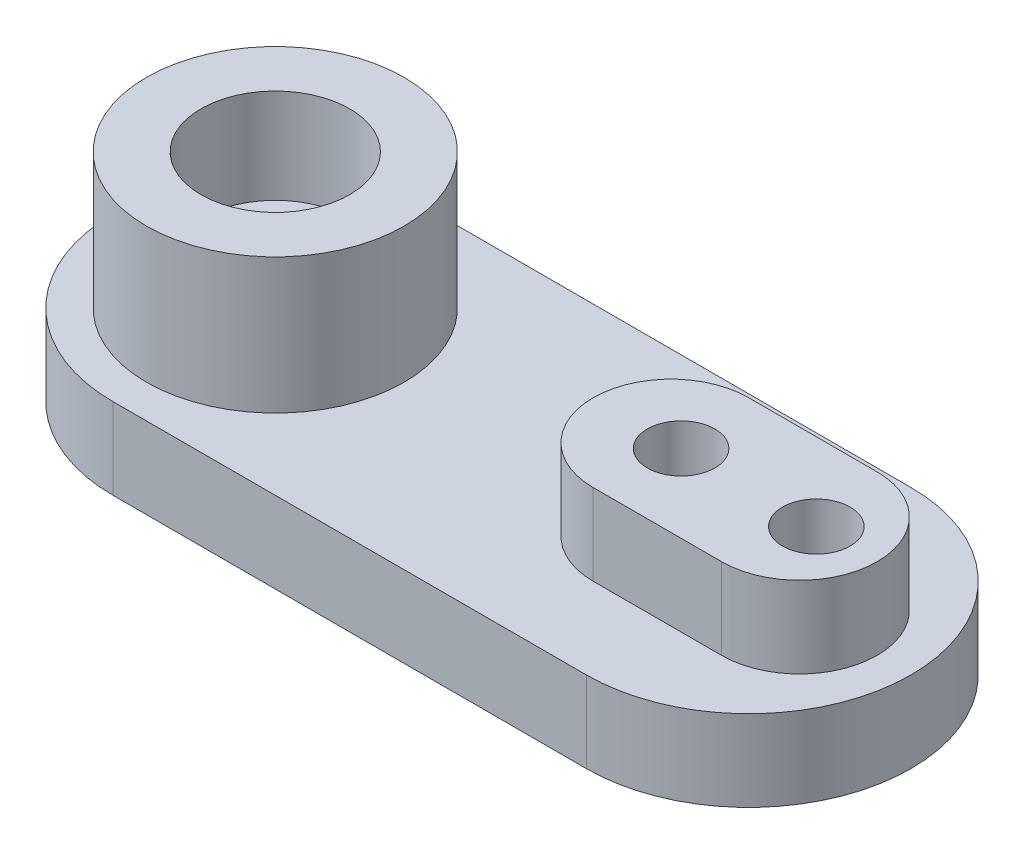
ISO-10303-21;
HEADER;
FILE_DESCRIPTION(('STEP AP214'),'2;1');
FILE_NAME('part.step','',(''),(''),'','','');
FILE_SCHEMA(('AUTOMOTIVE_DESIGN { 1 0 10303 214 1 1 1 1 }'));
ENDSEC;
DATA;
#1=APPLICATION_CONTEXT('core data for automotive mechanical design processes');
#2=APPLICATION_PROTOCOL_DEFINITION('international standard','automotive_design',2000,#1);
#3=PRODUCT_CONTEXT('',#1,'mechanical');
#4=PRODUCT('Part','Part','',(#3));
#5=PRODUCT_RELATED_PRODUCT_CATEGORY('part','',(#4));
#6=PRODUCT_DEFINITION_FORMATION('','',#4);
#7=PRODUCT_DEFINITION_CONTEXT('part definition',#1,'design');
#8=PRODUCT_DEFINITION('design','',#6,#7);
#9=PRODUCT_DEFINITION_SHAPE('','',#8);
#10=(LENGTH_UNIT() NAMED_UNIT(*) SI_UNIT(.MILLI.,.METRE.));
#11=(NAMED_UNIT(*) PLANE_ANGLE_UNIT() SI_UNIT($,.RADIAN.));
#12=(NAMED_UNIT(*) SI_UNIT($,.STERADIAN.) SOLID_ANGLE_UNIT());
#13=UNCERTAINTY_MEASURE_WITH_UNIT(LENGTH_MEASURE(1.E-05),#10,'distance_accuracy_value','');
#14=(GEOMETRIC_REPRESENTATION_CONTEXT(3) GLOBAL_UNCERTAINTY_ASSIGNED_CONTEXT((#13)) GLOBAL_UNIT_ASSIGNED_CONTEXT((#10,
#11,#12)) REPRESENTATION_CONTEXT('',''));
#15=CARTESIAN_POINT('',(0.,0.,0.));
#16=DIRECTION('',(0.,0.,1.));
#17=DIRECTION('',(1.,0.,0.));
#18=AXIS2_PLACEMENT_3D('',#15,#16,#17);
#19=CARTESIAN_POINT('',(0.,0.,0.));
#20=DIRECTION('',(0.,1.,0.));
#21=DIRECTION('',(0.,0.,1.));
#22=AXIS2_PLACEMENT_3D('',#19,#20,#21);
#23=CYLINDRICAL_SURFACE('',#22,1.75);
#24=CARTESIAN_POINT('',(0.,4.5,0.));
#25=DIRECTION('',(0.,1.,0.));
#26=DIRECTION('',(0.,0.,1.));
#27=AXIS2_PLACEMENT_3D('',#24,#25,#26);
#28=CIRCLE('',#27,1.75);
#29=CARTESIAN_POINT('',(0.,4.5,1.75));
#30=VERTEX_POINT('',#29);
#31=EDGE_CURVE('E271',#30,#30,#28,.T.);
#32=ORIENTED_EDGE('',*,*,#31,.T.);
#33=EDGE_LOOP('',(#32));
#34=FACE_BOUND('',#33,.T.);
#35=CARTESIAN_POINT('',(0.,2.5,0.));
#36=DIRECTION('',(0.,-1.,0.));
#37=DIRECTION('',(0.,0.,-1.));
#38=AXIS2_PLACEMENT_3D('',#35,#36,#37);
#39=CIRCLE('',#38,1.75);
#40=CARTESIAN_POINT('',(0.,2.5,-1.75));
#41=VERTEX_POINT('',#40);
#42=EDGE_CURVE('E36',#41,#41,#39,.F.);
#43=ORIENTED_EDGE('',*,*,#42,.F.);
#44=EDGE_LOOP('',(#43));
#45=FACE_BOUND('',#44,.T.);
#46=ADVANCED_FACE('F32',(#34,#45),#23,.F.);
#47=CARTESIAN_POINT('',(0.,3.,0.));
#48=DIRECTION('',(0.,1.,0.));
#49=DIRECTION('',(0.,0.,1.));
#50=AXIS2_PLACEMENT_3D('',#47,#48,#49);
#51=PLANE('',#50);
#52=CARTESIAN_POINT('',(0.,3.,0.));
#53=DIRECTION('',(0.,1.,0.));
#54=DIRECTION('',(0.,0.,1.));
#55=AXIS2_PLACEMENT_3D('',#52,#53,#54);
#56=CIRCLE('',#55,4.7625);
#57=CARTESIAN_POINT('',(0.,3.,4.7625));
#58=VERTEX_POINT('',#57);
#59=EDGE_CURVE('E132',#58,#58,#56,.T.);
#60=ORIENTED_EDGE('',*,*,#59,.F.);
#61=EDGE_LOOP('',(#60));
#62=FACE_BOUND('',#61,.T.);
#63=CARTESIAN_POINT('',(0.,3.,0.));
#64=DIRECTION('',(0.,1.,0.));
#65=DIRECTION('',(0.,0.,1.));
#66=AXIS2_PLACEMENT_3D('',#63,#64,#65);
#67=CIRCLE('',#66,6.);
#68=CARTESIAN_POINT('',(0.,3.,-6.));
#69=VERTEX_POINT('',#68);
#70=CARTESIAN_POINT('',(0.,3.,6.));
#71=VERTEX_POINT('',#70);
#72=EDGE_CURVE('E143',#69,#71,#67,.T.);
#73=ORIENTED_EDGE('',*,*,#72,.T.);
#74=DIRECTION('',(1.,0.,0.));
#75=VECTOR('',#74,1.);
#76=CARTESIAN_POINT('',(0.,3.,6.));
#77=LINE('',#76,#75);
#78=CARTESIAN_POINT('',(17.5,3.,6.));
#79=VERTEX_POINT('',#78);
#80=EDGE_CURVE('E85',#71,#79,#77,.T.);
#81=ORIENTED_EDGE('',*,*,#80,.T.);
#82=CARTESIAN_POINT('',(17.5,3.,0.));
#83=DIRECTION('',(0.,1.,0.));
#84=DIRECTION('',(0.,0.,1.));
#85=AXIS2_PLACEMENT_3D('',#82,#83,#84);
#86=CIRCLE('',#85,6.);
#87=CARTESIAN_POINT('',(17.5,3.,-6.));
#88=VERTEX_POINT('',#87);
#89=EDGE_CURVE('E146',#79,#88,#86,.T.);
#90=ORIENTED_EDGE('',*,*,#89,.T.);
#91=DIRECTION('',(-1.,0.,0.));
#92=VECTOR('',#91,1.);
#93=CARTESIAN_POINT('',(0.,3.,-6.));
#94=LINE('',#93,#92);
#95=EDGE_CURVE('E57',#88,#69,#94,.T.);
#96=ORIENTED_EDGE('',*,*,#95,.T.);
#97=EDGE_LOOP('',(#73,#81,#90,#96));
#98=FACE_BOUND('',#97,.T.);
#99=DIRECTION('',(-1.,0.,0.));
#100=VECTOR('',#99,1.);
#101=CARTESIAN_POINT('',(19.375,3.,-2.875));
#102=LINE('',#101,#100);
#103=CARTESIAN_POINT('',(19.375,3.,-2.875));
#104=VERTEX_POINT('',#103);
#105=CARTESIAN_POINT('',(14.625,3.,-2.875));
#106=VERTEX_POINT('',#105);
#107=EDGE_CURVE('E243',#104,#106,#102,.T.);
#108=ORIENTED_EDGE('',*,*,#107,.F.);
#109=CARTESIAN_POINT('',(19.375,3.,0.));
#110=DIRECTION('',(0.,1.,0.));
#111=DIRECTION('',(0.,0.,1.));
#112=AXIS2_PLACEMENT_3D('',#109,#110,#111);
#113=CIRCLE('',#112,2.875);
#114=CARTESIAN_POINT('',(19.375,3.,2.875));
#115=VERTEX_POINT('',#114);
#116=EDGE_CURVE('E130',#115,#104,#113,.T.);
#117=ORIENTED_EDGE('',*,*,#116,.F.);
#118=DIRECTION('',(1.,0.,0.));
#119=VECTOR('',#118,1.);
#120=CARTESIAN_POINT('',(19.375,3.,2.875));
#121=LINE('',#120,#119);
#122=CARTESIAN_POINT('',(14.625,3.,2.875));
#123=VERTEX_POINT('',#122);
#124=EDGE_CURVE('E126',#123,#115,#121,.T.);
#125=ORIENTED_EDGE('',*,*,#124,.F.);
#126=CARTESIAN_POINT('',(14.625,3.,0.));
#127=DIRECTION('',(0.,1.,0.));
#128=DIRECTION('',(0.,0.,1.));
#129=AXIS2_PLACEMENT_3D('',#126,#127,#128);
#130=CIRCLE('',#129,2.875);
#131=EDGE_CURVE('E245',#106,#123,#130,.T.);
#132=ORIENTED_EDGE('',*,*,#131,.F.);
#133=EDGE_LOOP('',(#108,#117,#125,#132));
#134=FACE_BOUND('',#133,.T.);
#135=ADVANCED_FACE('F185',(#62,#98,#134),#51,.T.);
#136=CARTESIAN_POINT('',(0.,3.,0.));
#137=DIRECTION('',(0.,-1.,0.));
#138=DIRECTION('',(0.,0.,-1.));
#139=AXIS2_PLACEMENT_3D('',#136,#137,#138);
#140=CYLINDRICAL_SURFACE('',#139,6.);
#141=CARTESIAN_POINT('',(0.,0.,0.));
#142=DIRECTION('',(0.,1.,0.));
#143=DIRECTION('',(0.,0.,1.));
#144=AXIS2_PLACEMENT_3D('',#141,#142,#143);
#145=CIRCLE('',#144,6.);
#146=CARTESIAN_POINT('',(0.,0.,-6.));
#147=VERTEX_POINT('',#146);
#148=CARTESIAN_POINT('',(0.,0.,6.));
#149=VERTEX_POINT('',#148);
#150=EDGE_CURVE('E141',#147,#149,#145,.T.);
#151=ORIENTED_EDGE('',*,*,#150,.T.);
#152=DIRECTION('',(0.,-1.,0.));
#153=VECTOR('',#152,1.);
#154=CARTESIAN_POINT('',(0.,3.,6.));
#155=LINE('',#154,#153);
#156=EDGE_CURVE('E11',#71,#149,#155,.T.);
#157=ORIENTED_EDGE('',*,*,#156,.F.);
#158=ORIENTED_EDGE('',*,*,#72,.F.);
#159=DIRECTION('',(0.,-1.,0.));
#160=VECTOR('',#159,1.);
#161=CARTESIAN_POINT('',(0.,3.,-6.));
#162=LINE('',#161,#160);
#163=EDGE_CURVE('E149',#69,#147,#162,.T.);
#164=ORIENTED_EDGE('',*,*,#163,.T.);
#165=EDGE_LOOP('',(#151,#157,#158,#164));
#166=FACE_BOUND('',#165,.T.);
#167=ADVANCED_FACE('F34',(#166),#140,.T.);
#168=CARTESIAN_POINT('',(0.,3.,6.));
#169=DIRECTION('',(0.,0.,-1.));
#170=DIRECTION('',(-1.,0.,0.));
#171=AXIS2_PLACEMENT_3D('',#168,#169,#170);
#172=PLANE('',#171);
#173=DIRECTION('',(1.,0.,0.));
#174=VECTOR('',#173,1.);
#175=CARTESIAN_POINT('',(0.,0.,6.));
#176=LINE('',#175,#174);
#177=CARTESIAN_POINT('',(17.5,0.,6.));
#178=VERTEX_POINT('',#177);
#179=EDGE_CURVE('E152',#149,#178,#176,.T.);
#180=ORIENTED_EDGE('',*,*,#179,.T.);
#181=DIRECTION('',(0.,-1.,0.));
#182=VECTOR('',#181,1.);
#183=CARTESIAN_POINT('',(17.5,3.,6.));
#184=LINE('',#183,#182);
#185=EDGE_CURVE('E41',#79,#178,#184,.T.);
#186=ORIENTED_EDGE('',*,*,#185,.F.);
#187=ORIENTED_EDGE('',*,*,#80,.F.);
#188=ORIENTED_EDGE('',*,*,#156,.T.);
#189=EDGE_LOOP('',(#180,#186,#187,#188));
#190=FACE_BOUND('',#189,.T.);
#191=ADVANCED_FACE('F182',(#190),#172,.F.);
#192=CARTESIAN_POINT('',(17.5,3.,0.));
#193=DIRECTION('',(0.,-1.,0.));
#194=DIRECTION('',(0.,0.,-1.));
#195=AXIS2_PLACEMENT_3D('',#192,#193,#194);
#196=CYLINDRICAL_SURFACE('',#195,6.);
#197=CARTESIAN_POINT('',(17.5,0.,0.));
#198=DIRECTION('',(0.,1.,0.));
#199=DIRECTION('',(0.,0.,1.));
#200=AXIS2_PLACEMENT_3D('',#197,#198,#199);
#201=CIRCLE('',#200,6.);
#202=CARTESIAN_POINT('',(17.5,0.,-6.));
#203=VERTEX_POINT('',#202);
#204=EDGE_CURVE('E154',#178,#203,#201,.T.);
#205=ORIENTED_EDGE('',*,*,#204,.T.);
#206=DIRECTION('',(0.,-1.,0.));
#207=VECTOR('',#206,1.);
#208=CARTESIAN_POINT('',(17.5,3.,-6.));
#209=LINE('',#208,#207);
#210=EDGE_CURVE('E158',#88,#203,#209,.T.);
#211=ORIENTED_EDGE('',*,*,#210,.F.);
#212=ORIENTED_EDGE('',*,*,#89,.F.);
#213=ORIENTED_EDGE('',*,*,#185,.T.);
#214=EDGE_LOOP('',(#205,#211,#212,#213));
#215=FACE_BOUND('',#214,.T.);
#216=ADVANCED_FACE('F164',(#215),#196,.T.);
#217=CARTESIAN_POINT('',(0.,3.,-6.));
#218=DIRECTION('',(0.,0.,1.));
#219=DIRECTION('',(1.,0.,0.));
#220=AXIS2_PLACEMENT_3D('',#217,#218,#219);
#221=PLANE('',#220);
#222=DIRECTION('',(-1.,0.,0.));
#223=VECTOR('',#222,1.);
#224=CARTESIAN_POINT('',(0.,0.,-6.));
#225=LINE('',#224,#223);
#226=EDGE_CURVE('E78',#203,#147,#225,.T.);
#227=ORIENTED_EDGE('',*,*,#226,.T.);
#228=ORIENTED_EDGE('',*,*,#163,.F.);
#229=ORIENTED_EDGE('',*,*,#95,.F.);
#230=ORIENTED_EDGE('',*,*,#210,.T.);
#231=EDGE_LOOP('',(#227,#228,#229,#230));
#232=FACE_BOUND('',#231,.T.);
#233=ADVANCED_FACE('F172',(#232),#221,.F.);
#234=CARTESIAN_POINT('',(0.,0.,0.));
#235=DIRECTION('',(0.,1.,0.));
#236=DIRECTION('',(0.,0.,1.));
#237=AXIS2_PLACEMENT_3D('',#234,#235,#236);
#238=PLANE('',#237);
#239=CARTESIAN_POINT('',(0.,0.,0.));
#240=DIRECTION('',(0.,-1.,0.));
#241=DIRECTION('',(0.,0.,-1.));
#242=AXIS2_PLACEMENT_3D('',#239,#240,#241);
#243=CIRCLE('',#242,3.);
#244=CARTESIAN_POINT('',(0.,0.,-3.));
#245=VERTEX_POINT('',#244);
#246=EDGE_CURVE('E275',#245,#245,#243,.T.);
#247=ORIENTED_EDGE('',*,*,#246,.F.);
#248=EDGE_LOOP('',(#247));
#249=FACE_BOUND('',#248,.T.);
#250=CARTESIAN_POINT('',(15.,0.,0.));
#251=DIRECTION('',(0.,1.,0.));
#252=DIRECTION('',(0.,0.,1.));
#253=AXIS2_PLACEMENT_3D('',#250,#251,#252);
#254=CIRCLE('',#253,1.25);
#255=CARTESIAN_POINT('',(15.,0.,1.25));
#256=VERTEX_POINT('',#255);
#257=EDGE_CURVE('E265',#256,#256,#254,.T.);
#258=ORIENTED_EDGE('',*,*,#257,.T.);
#259=EDGE_LOOP('',(#258));
#260=FACE_BOUND('',#259,.T.);
#261=CARTESIAN_POINT('',(20.,0.,0.));
#262=DIRECTION('',(0.,1.,0.));
#263=DIRECTION('',(0.,0.,1.));
#264=AXIS2_PLACEMENT_3D('',#261,#262,#263);
#265=CIRCLE('',#264,1.25);
#266=CARTESIAN_POINT('',(20.,0.,1.25));
#267=VERTEX_POINT('',#266);
#268=EDGE_CURVE('E259',#267,#267,#265,.T.);
#269=ORIENTED_EDGE('',*,*,#268,.T.);
#270=EDGE_LOOP('',(#269));
#271=FACE_BOUND('',#270,.T.);
#272=ORIENTED_EDGE('',*,*,#150,.F.);
#273=ORIENTED_EDGE('',*,*,#226,.F.);
#274=ORIENTED_EDGE('',*,*,#204,.F.);
#275=ORIENTED_EDGE('',*,*,#179,.F.);
#276=EDGE_LOOP('',(#272,#273,#274,#275));
#277=FACE_BOUND('',#276,.T.);
#278=ADVANCED_FACE('F168',(#249,#260,#271,#277),#238,.F.);
#279=CARTESIAN_POINT('',(0.,8.,0.));
#280=DIRECTION('',(0.,-1.,0.));
#281=DIRECTION('',(0.,0.,-1.));
#282=AXIS2_PLACEMENT_3D('',#279,#280,#281);
#283=CYLINDRICAL_SURFACE('',#282,4.7625);
#284=CARTESIAN_POINT('',(0.,8.,0.));
#285=DIRECTION('',(0.,1.,0.));
#286=DIRECTION('',(0.,0.,1.));
#287=AXIS2_PLACEMENT_3D('',#284,#285,#286);
#288=CIRCLE('',#287,4.7625);
#289=CARTESIAN_POINT('',(0.,8.,4.7625));
#290=VERTEX_POINT('',#289);
#291=EDGE_CURVE('E135',#290,#290,#288,.T.);
#292=ORIENTED_EDGE('',*,*,#291,.F.);
#293=EDGE_LOOP('',(#292));
#294=FACE_BOUND('',#293,.T.);
#295=ORIENTED_EDGE('',*,*,#59,.T.);
#296=EDGE_LOOP('',(#295));
#297=FACE_BOUND('',#296,.T.);
#298=ADVANCED_FACE('F179',(#294,#297),#283,.T.);
#299=CARTESIAN_POINT('',(0.,8.,0.));
#300=DIRECTION('',(0.,1.,0.));
#301=DIRECTION('',(0.,0.,1.));
#302=AXIS2_PLACEMENT_3D('',#299,#300,#301);
#303=PLANE('',#302);
#304=CARTESIAN_POINT('',(0.,8.,0.));
#305=DIRECTION('',(0.,1.,0.));
#306=DIRECTION('',(0.,0.,1.));
#307=AXIS2_PLACEMENT_3D('',#304,#305,#306);
#308=CIRCLE('',#307,2.75);
#309=CARTESIAN_POINT('',(0.,8.,2.75));
#310=VERTEX_POINT('',#309);
#311=EDGE_CURVE('E256',#310,#310,#308,.T.);
#312=ORIENTED_EDGE('',*,*,#311,.F.);
#313=EDGE_LOOP('',(#312));
#314=FACE_BOUND('',#313,.T.);
#315=ORIENTED_EDGE('',*,*,#291,.T.);
#316=EDGE_LOOP('',(#315));
#317=FACE_BOUND('',#316,.T.);
#318=ADVANCED_FACE('F230',(#314,#317),#303,.T.);
#319=CARTESIAN_POINT('',(19.375,6.,0.));
#320=DIRECTION('',(0.,-1.,0.));
#321=DIRECTION('',(0.,0.,-1.));
#322=AXIS2_PLACEMENT_3D('',#319,#320,#321);
#323=CYLINDRICAL_SURFACE('',#322,2.875);
#324=ORIENTED_EDGE('',*,*,#116,.T.);
#325=DIRECTION('',(0.,-1.,0.));
#326=VECTOR('',#325,1.);
#327=CARTESIAN_POINT('',(19.375,6.,-2.875));
#328=LINE('',#327,#326);
#329=CARTESIAN_POINT('',(19.375,6.,-2.875));
#330=VERTEX_POINT('',#329);
#331=EDGE_CURVE('E111',#330,#104,#328,.T.);
#332=ORIENTED_EDGE('',*,*,#331,.F.);
#333=CARTESIAN_POINT('',(19.375,6.,0.));
#334=DIRECTION('',(0.,1.,0.));
#335=DIRECTION('',(0.,0.,1.));
#336=AXIS2_PLACEMENT_3D('',#333,#334,#335);
#337=CIRCLE('',#336,2.875);
#338=CARTESIAN_POINT('',(19.375,6.,2.875));
#339=VERTEX_POINT('',#338);
#340=EDGE_CURVE('E118',#339,#330,#337,.T.);
#341=ORIENTED_EDGE('',*,*,#340,.F.);
#342=DIRECTION('',(0.,-1.,0.));
#343=VECTOR('',#342,1.);
#344=CARTESIAN_POINT('',(19.375,6.,2.875));
#345=LINE('',#344,#343);
#346=EDGE_CURVE('E253',#339,#115,#345,.T.);
#347=ORIENTED_EDGE('',*,*,#346,.T.);
#348=EDGE_LOOP('',(#324,#332,#341,#347));
#349=FACE_BOUND('',#348,.T.);
#350=ADVANCED_FACE('F128',(#349),#323,.T.);
#351=CARTESIAN_POINT('',(19.375,6.,-2.875));
#352=DIRECTION('',(0.,0.,1.));
#353=DIRECTION('',(1.,0.,0.));
#354=AXIS2_PLACEMENT_3D('',#351,#352,#353);
#355=PLANE('',#354);
#356=ORIENTED_EDGE('',*,*,#107,.T.);
#357=DIRECTION('',(0.,-1.,0.));
#358=VECTOR('',#357,1.);
#359=CARTESIAN_POINT('',(14.625,6.,-2.875));
#360=LINE('',#359,#358);
#361=CARTESIAN_POINT('',(14.625,6.,-2.875));
#362=VERTEX_POINT('',#361);
#363=EDGE_CURVE('E114',#362,#106,#360,.T.);
#364=ORIENTED_EDGE('',*,*,#363,.F.);
#365=DIRECTION('',(-1.,0.,0.));
#366=VECTOR('',#365,1.);
#367=CARTESIAN_POINT('',(19.375,6.,-2.875));
#368=LINE('',#367,#366);
#369=EDGE_CURVE('E107',#330,#362,#368,.T.);
#370=ORIENTED_EDGE('',*,*,#369,.F.);
#371=ORIENTED_EDGE('',*,*,#331,.T.);
#372=EDGE_LOOP('',(#356,#364,#370,#371));
#373=FACE_BOUND('',#372,.T.);
#374=ADVANCED_FACE('F109',(#373),#355,.F.);
#375=CARTESIAN_POINT('',(14.625,6.,0.));
#376=DIRECTION('',(0.,-1.,0.));
#377=DIRECTION('',(0.,0.,-1.));
#378=AXIS2_PLACEMENT_3D('',#375,#376,#377);
#379=CYLINDRICAL_SURFACE('',#378,2.875);
#380=ORIENTED_EDGE('',*,*,#131,.T.);
#381=DIRECTION('',(0.,-1.,0.));
#382=VECTOR('',#381,1.);
#383=CARTESIAN_POINT('',(14.625,6.,2.875));
#384=LINE('',#383,#382);
#385=CARTESIAN_POINT('',(14.625,6.,2.875));
#386=VERTEX_POINT('',#385);
#387=EDGE_CURVE('E48',#386,#123,#384,.T.);
#388=ORIENTED_EDGE('',*,*,#387,.F.);
#389=CARTESIAN_POINT('',(14.625,6.,0.));
#390=DIRECTION('',(0.,1.,0.));
#391=DIRECTION('',(0.,0.,1.));
#392=AXIS2_PLACEMENT_3D('',#389,#390,#391);
#393=CIRCLE('',#392,2.875);
#394=EDGE_CURVE('E117',#362,#386,#393,.T.);
#395=ORIENTED_EDGE('',*,*,#394,.F.);
#396=ORIENTED_EDGE('',*,*,#363,.T.);
#397=EDGE_LOOP('',(#380,#388,#395,#396));
#398=FACE_BOUND('',#397,.T.);
#399=ADVANCED_FACE('F222',(#398),#379,.T.);
#400=CARTESIAN_POINT('',(19.375,6.,2.875));
#401=DIRECTION('',(0.,0.,-1.));
#402=DIRECTION('',(-1.,0.,0.));
#403=AXIS2_PLACEMENT_3D('',#400,#401,#402);
#404=PLANE('',#403);
#405=ORIENTED_EDGE('',*,*,#124,.T.);
#406=ORIENTED_EDGE('',*,*,#346,.F.);
#407=DIRECTION('',(1.,0.,0.));
#408=VECTOR('',#407,1.);
#409=CARTESIAN_POINT('',(19.375,6.,2.875));
#410=LINE('',#409,#408);
#411=EDGE_CURVE('E122',#386,#339,#410,.T.);
#412=ORIENTED_EDGE('',*,*,#411,.F.);
#413=ORIENTED_EDGE('',*,*,#387,.T.);
#414=EDGE_LOOP('',(#405,#406,#412,#413));
#415=FACE_BOUND('',#414,.T.);
#416=ADVANCED_FACE('F218',(#415),#404,.F.);
#417=CARTESIAN_POINT('',(19.375,6.,0.));
#418=DIRECTION('',(0.,1.,0.));
#419=DIRECTION('',(0.,0.,1.));
#420=AXIS2_PLACEMENT_3D('',#417,#418,#419);
#421=PLANE('',#420);
#422=CARTESIAN_POINT('',(15.,6.,0.));
#423=DIRECTION('',(0.,1.,0.));
#424=DIRECTION('',(0.,0.,1.));
#425=AXIS2_PLACEMENT_3D('',#422,#423,#424);
#426=CIRCLE('',#425,1.25);
#427=CARTESIAN_POINT('',(15.,6.,1.25));
#428=VERTEX_POINT('',#427);
#429=EDGE_CURVE('E268',#428,#428,#426,.T.);
#430=ORIENTED_EDGE('',*,*,#429,.F.);
#431=EDGE_LOOP('',(#430));
#432=FACE_BOUND('',#431,.T.);
#433=CARTESIAN_POINT('',(20.,6.,0.));
#434=DIRECTION('',(0.,1.,0.));
#435=DIRECTION('',(0.,0.,1.));
#436=AXIS2_PLACEMENT_3D('',#433,#434,#435);
#437=CIRCLE('',#436,1.25);
#438=CARTESIAN_POINT('',(20.,6.,1.25));
#439=VERTEX_POINT('',#438);
#440=EDGE_CURVE('E262',#439,#439,#437,.T.);
#441=ORIENTED_EDGE('',*,*,#440,.F.);
#442=EDGE_LOOP('',(#441));
#443=FACE_BOUND('',#442,.T.);
#444=ORIENTED_EDGE('',*,*,#340,.T.);
#445=ORIENTED_EDGE('',*,*,#369,.T.);
#446=ORIENTED_EDGE('',*,*,#394,.T.);
#447=ORIENTED_EDGE('',*,*,#411,.T.);
#448=EDGE_LOOP('',(#444,#445,#446,#447));
#449=FACE_BOUND('',#448,.T.);
#450=ADVANCED_FACE('F121',(#432,#443,#449),#421,.T.);
#451=CARTESIAN_POINT('',(0.,4.5,0.));
#452=DIRECTION('',(0.,1.,0.));
#453=DIRECTION('',(0.,0.,1.));
#454=AXIS2_PLACEMENT_3D('',#451,#452,#453);
#455=CYLINDRICAL_SURFACE('',#454,2.75);
#456=CARTESIAN_POINT('',(0.,4.5,0.));
#457=DIRECTION('',(0.,1.,0.));
#458=DIRECTION('',(0.,0.,1.));
#459=AXIS2_PLACEMENT_3D('',#456,#457,#458);
#460=CIRCLE('',#459,2.75);
#461=CARTESIAN_POINT('',(0.,4.5,2.75));
#462=VERTEX_POINT('',#461);
#463=EDGE_CURVE('E248',#462,#462,#460,.T.);
#464=ORIENTED_EDGE('',*,*,#463,.F.);
#465=EDGE_LOOP('',(#464));
#466=FACE_BOUND('',#465,.T.);
#467=ORIENTED_EDGE('',*,*,#311,.T.);
#468=EDGE_LOOP('',(#467));
#469=FACE_BOUND('',#468,.T.);
#470=ADVANCED_FACE('F211',(#466,#469),#455,.F.);
#471=CARTESIAN_POINT('',(0.,4.5,0.));
#472=DIRECTION('',(0.,1.,0.));
#473=DIRECTION('',(0.,0.,1.));
#474=AXIS2_PLACEMENT_3D('',#471,#472,#473);
#475=PLANE('',#474);
#476=ORIENTED_EDGE('',*,*,#31,.F.);
#477=EDGE_LOOP('',(#476));
#478=FACE_BOUND('',#477,.T.);
#479=ORIENTED_EDGE('',*,*,#463,.T.);
#480=EDGE_LOOP('',(#479));
#481=FACE_BOUND('',#480,.T.);
#482=ADVANCED_FACE('F207',(#478,#481),#475,.T.);
#483=CARTESIAN_POINT('',(20.,0.,0.));
#484=DIRECTION('',(0.,1.,0.));
#485=DIRECTION('',(0.,0.,1.));
#486=AXIS2_PLACEMENT_3D('',#483,#484,#485);
#487=CYLINDRICAL_SURFACE('',#486,1.25);
#488=ORIENTED_EDGE('',*,*,#268,.F.);
#489=EDGE_LOOP('',(#488));
#490=FACE_BOUND('',#489,.T.);
#491=ORIENTED_EDGE('',*,*,#440,.T.);
#492=EDGE_LOOP('',(#491));
#493=FACE_BOUND('',#492,.T.);
#494=ADVANCED_FACE('F203',(#490,#493),#487,.F.);
#495=CARTESIAN_POINT('',(15.,0.,0.));
#496=DIRECTION('',(0.,1.,0.));
#497=DIRECTION('',(0.,0.,1.));
#498=AXIS2_PLACEMENT_3D('',#495,#496,#497);
#499=CYLINDRICAL_SURFACE('',#498,1.25);
#500=ORIENTED_EDGE('',*,*,#257,.F.);
#501=EDGE_LOOP('',(#500));
#502=FACE_BOUND('',#501,.T.);
#503=ORIENTED_EDGE('',*,*,#429,.T.);
#504=EDGE_LOOP('',(#503));
#505=FACE_BOUND('',#504,.T.);
#506=ADVANCED_FACE('F199',(#502,#505),#499,.F.);
#507=CARTESIAN_POINT('',(0.,2.5,0.));
#508=DIRECTION('',(0.,-1.,0.));
#509=DIRECTION('',(0.,0.,-1.));
#510=AXIS2_PLACEMENT_3D('',#507,#508,#509);
#511=PLANE('',#510);
#512=CARTESIAN_POINT('',(0.,2.5,0.));
#513=DIRECTION('',(0.,-1.,0.));
#514=DIRECTION('',(0.,0.,-1.));
#515=AXIS2_PLACEMENT_3D('',#512,#513,#514);
#516=CIRCLE('',#515,3.);
#517=CARTESIAN_POINT('',(0.,2.5,-3.));
#518=VERTEX_POINT('',#517);
#519=EDGE_CURVE('E278',#518,#518,#516,.T.);
#520=ORIENTED_EDGE('',*,*,#519,.T.);
#521=EDGE_LOOP('',(#520));
#522=FACE_BOUND('',#521,.T.);
#523=ORIENTED_EDGE('',*,*,#42,.T.);
#524=EDGE_LOOP('',(#523));
#525=FACE_BOUND('',#524,.T.);
#526=ADVANCED_FACE('F202',(#522,#525),#511,.T.);
#527=CARTESIAN_POINT('',(0.,2.5,0.));
#528=DIRECTION('',(0.,-1.,0.));
#529=DIRECTION('',(0.,0.,-1.));
#530=AXIS2_PLACEMENT_3D('',#527,#528,#529);
#531=CYLINDRICAL_SURFACE('',#530,3.);
#532=ORIENTED_EDGE('',*,*,#519,.F.);
#533=EDGE_LOOP('',(#532));
#534=FACE_BOUND('',#533,.T.);
#535=ORIENTED_EDGE('',*,*,#246,.T.);
#536=EDGE_LOOP('',(#535));
#537=FACE_BOUND('',#536,.T.);
#538=ADVANCED_FACE('F197',(#534,#537),#531,.F.);
#539=CLOSED_SHELL('',(#46,#135,#167,#191,#216,#233,#278,#298,#318,#350,#374,#399,#416,#450,#470,
#482,#494,#506,#526,#538));
#540=MANIFOLD_SOLID_BREP('B2',#539);
#541=ADVANCED_BREP_SHAPE_REPRESENTATION('',(#18,#540),#14);
#542=SHAPE_DEFINITION_REPRESENTATION(#9,#541);
ENDSEC;
END-ISO-10303-21;
